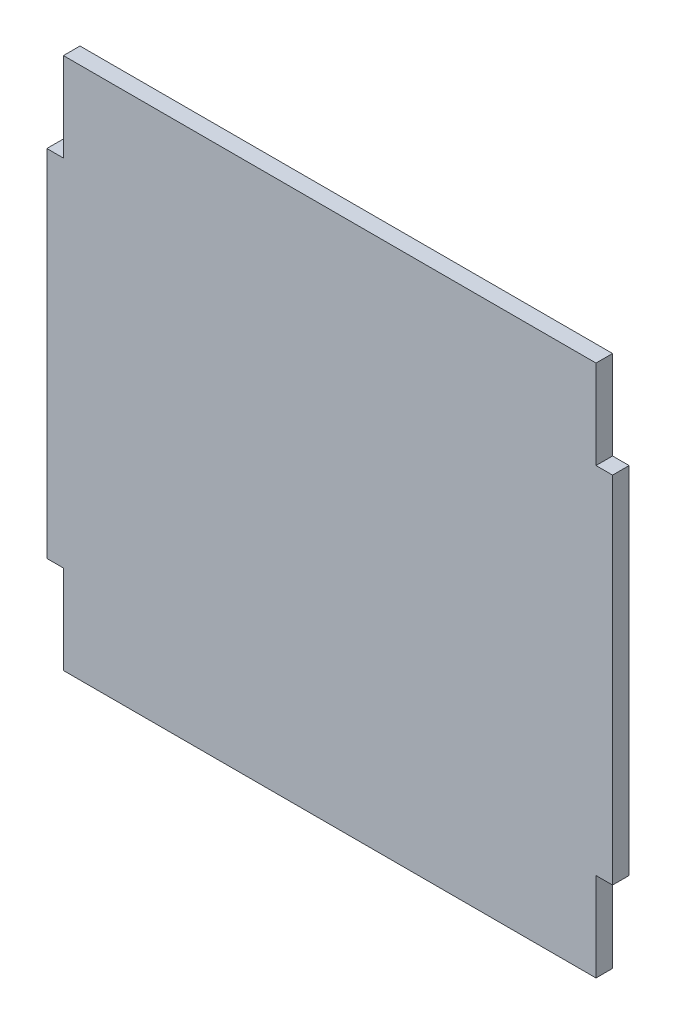
ISO-10303-21;
HEADER;
FILE_DESCRIPTION(('STEP AP214'),'2;1');
FILE_NAME('part.step','',(''),(''),'','','');
FILE_SCHEMA(('AUTOMOTIVE_DESIGN { 1 0 10303 214 1 1 1 1 }'));
ENDSEC;
DATA;
#1=APPLICATION_CONTEXT('core data for automotive mechanical design processes');
#2=APPLICATION_PROTOCOL_DEFINITION('international standard','automotive_design',2000,#1);
#3=PRODUCT_CONTEXT('',#1,'mechanical');
#4=PRODUCT('Part','Part','',(#3));
#5=PRODUCT_RELATED_PRODUCT_CATEGORY('part','',(#4));
#6=PRODUCT_DEFINITION_FORMATION('','',#4);
#7=PRODUCT_DEFINITION_CONTEXT('part definition',#1,'design');
#8=PRODUCT_DEFINITION('design','',#6,#7);
#9=PRODUCT_DEFINITION_SHAPE('','',#8);
#10=(LENGTH_UNIT() NAMED_UNIT(*) SI_UNIT(.MILLI.,.METRE.));
#11=(NAMED_UNIT(*) PLANE_ANGLE_UNIT() SI_UNIT($,.RADIAN.));
#12=(NAMED_UNIT(*) SI_UNIT($,.STERADIAN.) SOLID_ANGLE_UNIT());
#13=UNCERTAINTY_MEASURE_WITH_UNIT(LENGTH_MEASURE(1.E-05),#10,'distance_accuracy_value','');
#14=(GEOMETRIC_REPRESENTATION_CONTEXT(3) GLOBAL_UNCERTAINTY_ASSIGNED_CONTEXT((#13)) GLOBAL_UNIT_ASSIGNED_CONTEXT((#10,
#11,#12)) REPRESENTATION_CONTEXT('',''));
#15=CARTESIAN_POINT('',(0.,0.,0.));
#16=DIRECTION('',(0.,0.,1.));
#17=DIRECTION('',(1.,0.,0.));
#18=AXIS2_PLACEMENT_3D('',#15,#16,#17);
#19=CARTESIAN_POINT('',(45.,30.,1.4));
#20=DIRECTION('',(-1.,0.,0.));
#21=DIRECTION('',(0.,0.,1.));
#22=AXIS2_PLACEMENT_3D('',#19,#20,#21);
#23=PLANE('',#22);
#24=DIRECTION('',(0.,1.,0.));
#25=VECTOR('',#24,1.);
#26=CARTESIAN_POINT('',(45.,30.,-1.4));
#27=LINE('',#26,#25);
#28=CARTESIAN_POINT('',(45.,30.,-1.4));
#29=VERTEX_POINT('',#28);
#30=CARTESIAN_POINT('',(45.,45.,-1.4));
#31=VERTEX_POINT('',#30);
#32=EDGE_CURVE('E164',#29,#31,#27,.T.);
#33=ORIENTED_EDGE('',*,*,#32,.T.);
#34=DIRECTION('',(0.,0.,-1.));
#35=VECTOR('',#34,1.);
#36=CARTESIAN_POINT('',(45.,45.,1.4));
#37=LINE('',#36,#35);
#38=CARTESIAN_POINT('',(45.,45.,1.4));
#39=VERTEX_POINT('',#38);
#40=EDGE_CURVE('E11',#39,#31,#37,.T.);
#41=ORIENTED_EDGE('',*,*,#40,.F.);
#42=DIRECTION('',(0.,1.,0.));
#43=VECTOR('',#42,1.);
#44=CARTESIAN_POINT('',(45.,30.,1.4));
#45=LINE('',#44,#43);
#46=CARTESIAN_POINT('',(45.,30.,1.4));
#47=VERTEX_POINT('',#46);
#48=EDGE_CURVE('E198',#47,#39,#45,.T.);
#49=ORIENTED_EDGE('',*,*,#48,.F.);
#50=DIRECTION('',(0.,0.,-1.));
#51=VECTOR('',#50,1.);
#52=CARTESIAN_POINT('',(45.,30.,1.4));
#53=LINE('',#52,#51);
#54=EDGE_CURVE('E160',#47,#29,#53,.T.);
#55=ORIENTED_EDGE('',*,*,#54,.T.);
#56=EDGE_LOOP('',(#33,#41,#49,#55));
#57=FACE_BOUND('',#56,.T.);
#58=ADVANCED_FACE('F39',(#57),#23,.F.);
#59=CARTESIAN_POINT('',(-45.,45.,1.4));
#60=DIRECTION('',(0.,-1.,0.));
#61=DIRECTION('',(0.,0.,-1.));
#62=AXIS2_PLACEMENT_3D('',#59,#60,#61);
#63=PLANE('',#62);
#64=DIRECTION('',(-1.,0.,0.));
#65=VECTOR('',#64,1.);
#66=CARTESIAN_POINT('',(-45.,45.,-1.4));
#67=LINE('',#66,#65);
#68=CARTESIAN_POINT('',(-45.,45.,-1.4));
#69=VERTEX_POINT('',#68);
#70=EDGE_CURVE('E168',#31,#69,#67,.T.);
#71=ORIENTED_EDGE('',*,*,#70,.T.);
#72=DIRECTION('',(0.,0.,-1.));
#73=VECTOR('',#72,1.);
#74=CARTESIAN_POINT('',(-45.,45.,1.4));
#75=LINE('',#74,#73);
#76=CARTESIAN_POINT('',(-45.,45.,1.4));
#77=VERTEX_POINT('',#76);
#78=EDGE_CURVE('E48',#77,#69,#75,.T.);
#79=ORIENTED_EDGE('',*,*,#78,.F.);
#80=DIRECTION('',(-1.,0.,0.));
#81=VECTOR('',#80,1.);
#82=CARTESIAN_POINT('',(-45.,45.,1.4));
#83=LINE('',#82,#81);
#84=EDGE_CURVE('E111',#39,#77,#83,.T.);
#85=ORIENTED_EDGE('',*,*,#84,.F.);
#86=ORIENTED_EDGE('',*,*,#40,.T.);
#87=EDGE_LOOP('',(#71,#79,#85,#86));
#88=FACE_BOUND('',#87,.T.);
#89=ADVANCED_FACE('F292',(#88),#63,.F.);
#90=CARTESIAN_POINT('',(-45.,30.,1.4));
#91=DIRECTION('',(1.,0.,0.));
#92=DIRECTION('',(0.,0.,-1.));
#93=AXIS2_PLACEMENT_3D('',#90,#91,#92);
#94=PLANE('',#93);
#95=DIRECTION('',(0.,-1.,0.));
#96=VECTOR('',#95,1.);
#97=CARTESIAN_POINT('',(-45.,30.,-1.4));
#98=LINE('',#97,#96);
#99=CARTESIAN_POINT('',(-45.,30.,-1.4));
#100=VERTEX_POINT('',#99);
#101=EDGE_CURVE('E171',#69,#100,#98,.T.);
#102=ORIENTED_EDGE('',*,*,#101,.T.);
#103=DIRECTION('',(0.,0.,-1.));
#104=VECTOR('',#103,1.);
#105=CARTESIAN_POINT('',(-45.,30.,1.4));
#106=LINE('',#105,#104);
#107=CARTESIAN_POINT('',(-45.,30.,1.4));
#108=VERTEX_POINT('',#107);
#109=EDGE_CURVE('E225',#108,#100,#106,.T.);
#110=ORIENTED_EDGE('',*,*,#109,.F.);
#111=DIRECTION('',(0.,-1.,0.));
#112=VECTOR('',#111,1.);
#113=CARTESIAN_POINT('',(-45.,30.,1.4));
#114=LINE('',#113,#112);
#115=EDGE_CURVE('E235',#77,#108,#114,.T.);
#116=ORIENTED_EDGE('',*,*,#115,.F.);
#117=ORIENTED_EDGE('',*,*,#78,.T.);
#118=EDGE_LOOP('',(#102,#110,#116,#117));
#119=FACE_BOUND('',#118,.T.);
#120=ADVANCED_FACE('F233',(#119),#94,.F.);
#121=CARTESIAN_POINT('',(-45.,30.,1.4));
#122=DIRECTION('',(0.,-1.,0.));
#123=DIRECTION('',(0.,0.,-1.));
#124=AXIS2_PLACEMENT_3D('',#121,#122,#123);
#125=PLANE('',#124);
#126=DIRECTION('',(-1.,0.,0.));
#127=VECTOR('',#126,1.);
#128=CARTESIAN_POINT('',(-45.,30.,-1.4));
#129=LINE('',#128,#127);
#130=CARTESIAN_POINT('',(-47.8,30.,-1.4));
#131=VERTEX_POINT('',#130);
#132=EDGE_CURVE('E174',#100,#131,#129,.T.);
#133=ORIENTED_EDGE('',*,*,#132,.T.);
#134=DIRECTION('',(0.,0.,-1.));
#135=VECTOR('',#134,1.);
#136=CARTESIAN_POINT('',(-47.8,30.,1.4));
#137=LINE('',#136,#135);
#138=CARTESIAN_POINT('',(-47.8,30.,1.4));
#139=VERTEX_POINT('',#138);
#140=EDGE_CURVE('E221',#139,#131,#137,.T.);
#141=ORIENTED_EDGE('',*,*,#140,.F.);
#142=DIRECTION('',(-1.,0.,0.));
#143=VECTOR('',#142,1.);
#144=CARTESIAN_POINT('',(-45.,30.,1.4));
#145=LINE('',#144,#143);
#146=EDGE_CURVE('E254',#108,#139,#145,.T.);
#147=ORIENTED_EDGE('',*,*,#146,.F.);
#148=ORIENTED_EDGE('',*,*,#109,.T.);
#149=EDGE_LOOP('',(#133,#141,#147,#148));
#150=FACE_BOUND('',#149,.T.);
#151=ADVANCED_FACE('F244',(#150),#125,.F.);
#152=CARTESIAN_POINT('',(-47.8,-30.,1.4));
#153=DIRECTION('',(1.,0.,0.));
#154=DIRECTION('',(0.,0.,-1.));
#155=AXIS2_PLACEMENT_3D('',#152,#153,#154);
#156=PLANE('',#155);
#157=DIRECTION('',(0.,-1.,0.));
#158=VECTOR('',#157,1.);
#159=CARTESIAN_POINT('',(-47.8,-30.,-1.4));
#160=LINE('',#159,#158);
#161=CARTESIAN_POINT('',(-47.8,-30.,-1.4));
#162=VERTEX_POINT('',#161);
#163=EDGE_CURVE('E177',#131,#162,#160,.T.);
#164=ORIENTED_EDGE('',*,*,#163,.T.);
#165=DIRECTION('',(0.,0.,-1.));
#166=VECTOR('',#165,1.);
#167=CARTESIAN_POINT('',(-47.8,-30.,1.4));
#168=LINE('',#167,#166);
#169=CARTESIAN_POINT('',(-47.8,-30.,1.4));
#170=VERTEX_POINT('',#169);
#171=EDGE_CURVE('E217',#170,#162,#168,.T.);
#172=ORIENTED_EDGE('',*,*,#171,.F.);
#173=DIRECTION('',(0.,-1.,0.));
#174=VECTOR('',#173,1.);
#175=CARTESIAN_POINT('',(-47.8,-30.,1.4));
#176=LINE('',#175,#174);
#177=EDGE_CURVE('E250',#139,#170,#176,.T.);
#178=ORIENTED_EDGE('',*,*,#177,.F.);
#179=ORIENTED_EDGE('',*,*,#140,.T.);
#180=EDGE_LOOP('',(#164,#172,#178,#179));
#181=FACE_BOUND('',#180,.T.);
#182=ADVANCED_FACE('F248',(#181),#156,.F.);
#183=CARTESIAN_POINT('',(-45.,-30.,1.4));
#184=DIRECTION('',(0.,1.,0.));
#185=DIRECTION('',(0.,0.,1.));
#186=AXIS2_PLACEMENT_3D('',#183,#184,#185);
#187=PLANE('',#186);
#188=DIRECTION('',(1.,0.,0.));
#189=VECTOR('',#188,1.);
#190=CARTESIAN_POINT('',(-45.,-30.,-1.4));
#191=LINE('',#190,#189);
#192=CARTESIAN_POINT('',(-45.,-30.,-1.4));
#193=VERTEX_POINT('',#192);
#194=EDGE_CURVE('E180',#162,#193,#191,.T.);
#195=ORIENTED_EDGE('',*,*,#194,.T.);
#196=DIRECTION('',(0.,0.,-1.));
#197=VECTOR('',#196,1.);
#198=CARTESIAN_POINT('',(-45.,-30.,1.4));
#199=LINE('',#198,#197);
#200=CARTESIAN_POINT('',(-45.,-30.,1.4));
#201=VERTEX_POINT('',#200);
#202=EDGE_CURVE('E213',#201,#193,#199,.T.);
#203=ORIENTED_EDGE('',*,*,#202,.F.);
#204=DIRECTION('',(1.,0.,0.));
#205=VECTOR('',#204,1.);
#206=CARTESIAN_POINT('',(-45.,-30.,1.4));
#207=LINE('',#206,#205);
#208=EDGE_CURVE('E253',#170,#201,#207,.T.);
#209=ORIENTED_EDGE('',*,*,#208,.F.);
#210=ORIENTED_EDGE('',*,*,#171,.T.);
#211=EDGE_LOOP('',(#195,#203,#209,#210));
#212=FACE_BOUND('',#211,.T.);
#213=ADVANCED_FACE('F305',(#212),#187,.F.);
#214=CARTESIAN_POINT('',(-45.,-45.,1.4));
#215=DIRECTION('',(1.,0.,0.));
#216=DIRECTION('',(0.,0.,-1.));
#217=AXIS2_PLACEMENT_3D('',#214,#215,#216);
#218=PLANE('',#217);
#219=DIRECTION('',(0.,-1.,0.));
#220=VECTOR('',#219,1.);
#221=CARTESIAN_POINT('',(-45.,-45.,-1.4));
#222=LINE('',#221,#220);
#223=CARTESIAN_POINT('',(-45.,-45.,-1.4));
#224=VERTEX_POINT('',#223);
#225=EDGE_CURVE('E183',#193,#224,#222,.T.);
#226=ORIENTED_EDGE('',*,*,#225,.T.);
#227=DIRECTION('',(0.,0.,-1.));
#228=VECTOR('',#227,1.);
#229=CARTESIAN_POINT('',(-45.,-45.,1.4));
#230=LINE('',#229,#228);
#231=CARTESIAN_POINT('',(-45.,-45.,1.4));
#232=VERTEX_POINT('',#231);
#233=EDGE_CURVE('E209',#232,#224,#230,.T.);
#234=ORIENTED_EDGE('',*,*,#233,.F.);
#235=DIRECTION('',(0.,-1.,0.));
#236=VECTOR('',#235,1.);
#237=CARTESIAN_POINT('',(-45.,-45.,1.4));
#238=LINE('',#237,#236);
#239=EDGE_CURVE('E258',#201,#232,#238,.T.);
#240=ORIENTED_EDGE('',*,*,#239,.F.);
#241=ORIENTED_EDGE('',*,*,#202,.T.);
#242=EDGE_LOOP('',(#226,#234,#240,#241));
#243=FACE_BOUND('',#242,.T.);
#244=ADVANCED_FACE('F308',(#243),#218,.F.);
#245=CARTESIAN_POINT('',(-45.,-45.,1.4));
#246=DIRECTION('',(0.,1.,0.));
#247=DIRECTION('',(0.,0.,1.));
#248=AXIS2_PLACEMENT_3D('',#245,#246,#247);
#249=PLANE('',#248);
#250=DIRECTION('',(1.,0.,0.));
#251=VECTOR('',#250,1.);
#252=CARTESIAN_POINT('',(-45.,-45.,-1.4));
#253=LINE('',#252,#251);
#254=CARTESIAN_POINT('',(45.,-45.,-1.4));
#255=VERTEX_POINT('',#254);
#256=EDGE_CURVE('E186',#224,#255,#253,.T.);
#257=ORIENTED_EDGE('',*,*,#256,.T.);
#258=DIRECTION('',(0.,0.,-1.));
#259=VECTOR('',#258,1.);
#260=CARTESIAN_POINT('',(45.,-45.,1.4));
#261=LINE('',#260,#259);
#262=CARTESIAN_POINT('',(45.,-45.,1.4));
#263=VERTEX_POINT('',#262);
#264=EDGE_CURVE('E205',#263,#255,#261,.T.);
#265=ORIENTED_EDGE('',*,*,#264,.F.);
#266=DIRECTION('',(1.,0.,0.));
#267=VECTOR('',#266,1.);
#268=CARTESIAN_POINT('',(-45.,-45.,1.4));
#269=LINE('',#268,#267);
#270=EDGE_CURVE('E265',#232,#263,#269,.T.);
#271=ORIENTED_EDGE('',*,*,#270,.F.);
#272=ORIENTED_EDGE('',*,*,#233,.T.);
#273=EDGE_LOOP('',(#257,#265,#271,#272));
#274=FACE_BOUND('',#273,.T.);
#275=ADVANCED_FACE('F273',(#274),#249,.F.);
#276=CARTESIAN_POINT('',(45.,-45.,1.4));
#277=DIRECTION('',(-1.,0.,0.));
#278=DIRECTION('',(0.,0.,1.));
#279=AXIS2_PLACEMENT_3D('',#276,#277,#278);
#280=PLANE('',#279);
#281=DIRECTION('',(0.,1.,0.));
#282=VECTOR('',#281,1.);
#283=CARTESIAN_POINT('',(45.,-45.,-1.4));
#284=LINE('',#283,#282);
#285=CARTESIAN_POINT('',(45.,-30.,-1.4));
#286=VERTEX_POINT('',#285);
#287=EDGE_CURVE('E189',#255,#286,#284,.T.);
#288=ORIENTED_EDGE('',*,*,#287,.T.);
#289=DIRECTION('',(0.,0.,-1.));
#290=VECTOR('',#289,1.);
#291=CARTESIAN_POINT('',(45.,-30.,1.4));
#292=LINE('',#291,#290);
#293=CARTESIAN_POINT('',(45.,-30.,1.4));
#294=VERTEX_POINT('',#293);
#295=EDGE_CURVE('E153',#294,#286,#292,.T.);
#296=ORIENTED_EDGE('',*,*,#295,.F.);
#297=DIRECTION('',(0.,1.,0.));
#298=VECTOR('',#297,1.);
#299=CARTESIAN_POINT('',(45.,-45.,1.4));
#300=LINE('',#299,#298);
#301=EDGE_CURVE('E142',#263,#294,#300,.T.);
#302=ORIENTED_EDGE('',*,*,#301,.F.);
#303=ORIENTED_EDGE('',*,*,#264,.T.);
#304=EDGE_LOOP('',(#288,#296,#302,#303));
#305=FACE_BOUND('',#304,.T.);
#306=ADVANCED_FACE('F277',(#305),#280,.F.);
#307=CARTESIAN_POINT('',(45.,-30.,1.4));
#308=DIRECTION('',(0.,1.,0.));
#309=DIRECTION('',(0.,0.,1.));
#310=AXIS2_PLACEMENT_3D('',#307,#308,#309);
#311=PLANE('',#310);
#312=DIRECTION('',(1.,0.,0.));
#313=VECTOR('',#312,1.);
#314=CARTESIAN_POINT('',(45.,-30.,-1.4));
#315=LINE('',#314,#313);
#316=CARTESIAN_POINT('',(47.8,-30.,-1.4));
#317=VERTEX_POINT('',#316);
#318=EDGE_CURVE('E151',#286,#317,#315,.T.);
#319=ORIENTED_EDGE('',*,*,#318,.T.);
#320=DIRECTION('',(0.,0.,-1.));
#321=VECTOR('',#320,1.);
#322=CARTESIAN_POINT('',(47.8,-30.,1.4));
#323=LINE('',#322,#321);
#324=CARTESIAN_POINT('',(47.8,-30.,1.4));
#325=VERTEX_POINT('',#324);
#326=EDGE_CURVE('E148',#325,#317,#323,.T.);
#327=ORIENTED_EDGE('',*,*,#326,.F.);
#328=DIRECTION('',(1.,0.,0.));
#329=VECTOR('',#328,1.);
#330=CARTESIAN_POINT('',(45.,-30.,1.4));
#331=LINE('',#330,#329);
#332=EDGE_CURVE('E136',#294,#325,#331,.T.);
#333=ORIENTED_EDGE('',*,*,#332,.F.);
#334=ORIENTED_EDGE('',*,*,#295,.T.);
#335=EDGE_LOOP('',(#319,#327,#333,#334));
#336=FACE_BOUND('',#335,.T.);
#337=ADVANCED_FACE('F149',(#336),#311,.F.);
#338=CARTESIAN_POINT('',(47.8,-30.,1.4));
#339=DIRECTION('',(-1.,0.,0.));
#340=DIRECTION('',(0.,0.,1.));
#341=AXIS2_PLACEMENT_3D('',#338,#339,#340);
#342=PLANE('',#341);
#343=DIRECTION('',(0.,1.,0.));
#344=VECTOR('',#343,1.);
#345=CARTESIAN_POINT('',(47.8,-30.,-1.4));
#346=LINE('',#345,#344);
#347=CARTESIAN_POINT('',(47.8,30.,-1.4));
#348=VERTEX_POINT('',#347);
#349=EDGE_CURVE('E97',#317,#348,#346,.T.);
#350=ORIENTED_EDGE('',*,*,#349,.T.);
#351=DIRECTION('',(0.,0.,-1.));
#352=VECTOR('',#351,1.);
#353=CARTESIAN_POINT('',(47.8,30.,1.4));
#354=LINE('',#353,#352);
#355=CARTESIAN_POINT('',(47.8,30.,1.4));
#356=VERTEX_POINT('',#355);
#357=EDGE_CURVE('E154',#356,#348,#354,.T.);
#358=ORIENTED_EDGE('',*,*,#357,.F.);
#359=DIRECTION('',(0.,1.,0.));
#360=VECTOR('',#359,1.);
#361=CARTESIAN_POINT('',(47.8,-30.,1.4));
#362=LINE('',#361,#360);
#363=EDGE_CURVE('E140',#325,#356,#362,.T.);
#364=ORIENTED_EDGE('',*,*,#363,.F.);
#365=ORIENTED_EDGE('',*,*,#326,.T.);
#366=EDGE_LOOP('',(#350,#358,#364,#365));
#367=FACE_BOUND('',#366,.T.);
#368=ADVANCED_FACE('F156',(#367),#342,.F.);
#369=CARTESIAN_POINT('',(45.,30.,1.4));
#370=DIRECTION('',(0.,-1.,0.));
#371=DIRECTION('',(0.,0.,-1.));
#372=AXIS2_PLACEMENT_3D('',#369,#370,#371);
#373=PLANE('',#372);
#374=DIRECTION('',(-1.,0.,0.));
#375=VECTOR('',#374,1.);
#376=CARTESIAN_POINT('',(45.,30.,-1.4));
#377=LINE('',#376,#375);
#378=EDGE_CURVE('E103',#348,#29,#377,.T.);
#379=ORIENTED_EDGE('',*,*,#378,.T.);
#380=ORIENTED_EDGE('',*,*,#54,.F.);
#381=DIRECTION('',(-1.,0.,0.));
#382=VECTOR('',#381,1.);
#383=CARTESIAN_POINT('',(45.,30.,1.4));
#384=LINE('',#383,#382);
#385=EDGE_CURVE('E56',#356,#47,#384,.T.);
#386=ORIENTED_EDGE('',*,*,#385,.F.);
#387=ORIENTED_EDGE('',*,*,#357,.T.);
#388=EDGE_LOOP('',(#379,#380,#386,#387));
#389=FACE_BOUND('',#388,.T.);
#390=ADVANCED_FACE('F281',(#389),#373,.F.);
#391=CARTESIAN_POINT('',(0.,0.,1.4));
#392=DIRECTION('',(0.,0.,-1.));
#393=DIRECTION('',(-1.,0.,0.));
#394=AXIS2_PLACEMENT_3D('',#391,#392,#393);
#395=PLANE('',#394);
#396=ORIENTED_EDGE('',*,*,#48,.T.);
#397=ORIENTED_EDGE('',*,*,#84,.T.);
#398=ORIENTED_EDGE('',*,*,#115,.T.);
#399=ORIENTED_EDGE('',*,*,#146,.T.);
#400=ORIENTED_EDGE('',*,*,#177,.T.);
#401=ORIENTED_EDGE('',*,*,#208,.T.);
#402=ORIENTED_EDGE('',*,*,#239,.T.);
#403=ORIENTED_EDGE('',*,*,#270,.T.);
#404=ORIENTED_EDGE('',*,*,#301,.T.);
#405=ORIENTED_EDGE('',*,*,#332,.T.);
#406=ORIENTED_EDGE('',*,*,#363,.T.);
#407=ORIENTED_EDGE('',*,*,#385,.T.);
#408=EDGE_LOOP('',(#396,#397,#398,#399,#400,#401,#402,#403,#404,#405,#406,#407));
#409=FACE_BOUND('',#408,.T.);
#410=ADVANCED_FACE('F138',(#409),#395,.F.);
#411=CARTESIAN_POINT('',(0.,0.,-1.4));
#412=DIRECTION('',(0.,0.,-1.));
#413=DIRECTION('',(-1.,0.,0.));
#414=AXIS2_PLACEMENT_3D('',#411,#412,#413);
#415=PLANE('',#414);
#416=ORIENTED_EDGE('',*,*,#32,.F.);
#417=ORIENTED_EDGE('',*,*,#378,.F.);
#418=ORIENTED_EDGE('',*,*,#349,.F.);
#419=ORIENTED_EDGE('',*,*,#318,.F.);
#420=ORIENTED_EDGE('',*,*,#287,.F.);
#421=ORIENTED_EDGE('',*,*,#256,.F.);
#422=ORIENTED_EDGE('',*,*,#225,.F.);
#423=ORIENTED_EDGE('',*,*,#194,.F.);
#424=ORIENTED_EDGE('',*,*,#163,.F.);
#425=ORIENTED_EDGE('',*,*,#132,.F.);
#426=ORIENTED_EDGE('',*,*,#101,.F.);
#427=ORIENTED_EDGE('',*,*,#70,.F.);
#428=EDGE_LOOP('',(#416,#417,#418,#419,#420,#421,#422,#423,#424,#425,#426,#427));
#429=FACE_BOUND('',#428,.T.);
#430=ADVANCED_FACE('F239',(#429),#415,.T.);
#431=CLOSED_SHELL('',(#58,#89,#120,#151,#182,#213,#244,#275,#306,#337,#368,#390,#410,#430));
#432=MANIFOLD_SOLID_BREP('B2',#431);
#433=ADVANCED_BREP_SHAPE_REPRESENTATION('',(#18,#432),#14);
#434=SHAPE_DEFINITION_REPRESENTATION(#9,#433);
ENDSEC;
END-ISO-10303-21;
